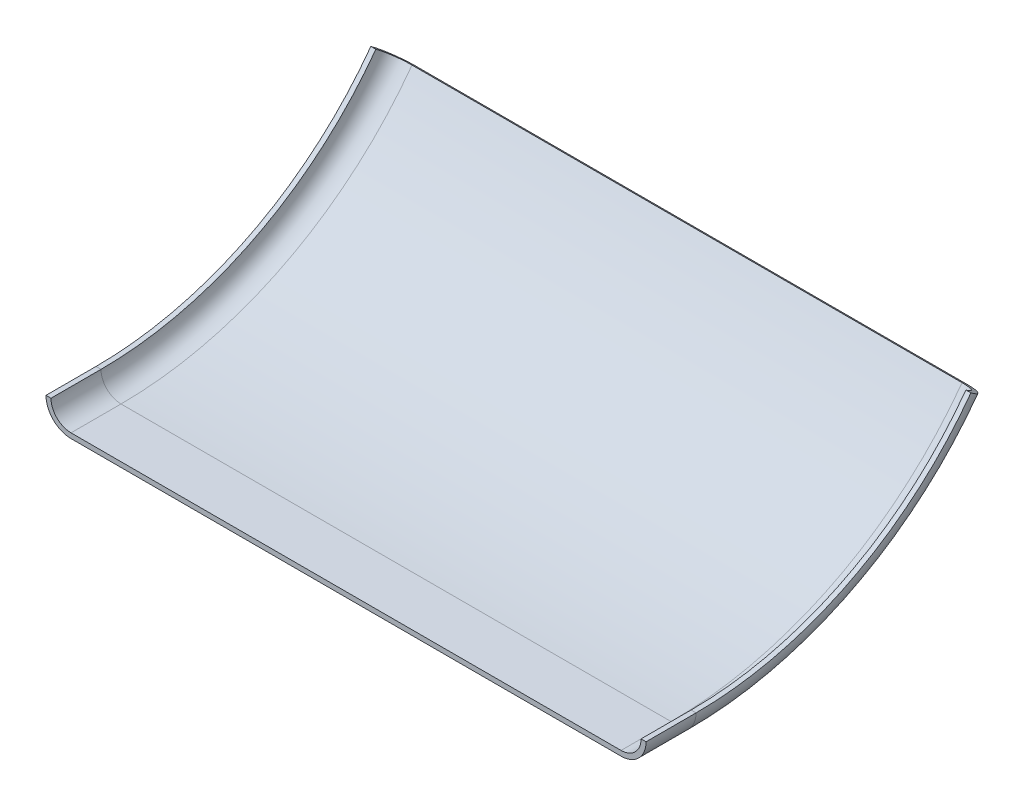
ISO-10303-21;
HEADER;
FILE_DESCRIPTION(('STEP AP214'),'2;1');
FILE_NAME('part.step','',(''),(''),'','','');
FILE_SCHEMA(('AUTOMOTIVE_DESIGN { 1 0 10303 214 1 1 1 1 }'));
ENDSEC;
DATA;
#1=APPLICATION_CONTEXT('core data for automotive mechanical design processes');
#2=APPLICATION_PROTOCOL_DEFINITION('international standard','automotive_design',2000,#1);
#3=PRODUCT_CONTEXT('',#1,'mechanical');
#4=PRODUCT('Part','Part','',(#3));
#5=PRODUCT_RELATED_PRODUCT_CATEGORY('part','',(#4));
#6=PRODUCT_DEFINITION_FORMATION('','',#4);
#7=PRODUCT_DEFINITION_CONTEXT('part definition',#1,'design');
#8=PRODUCT_DEFINITION('design','',#6,#7);
#9=PRODUCT_DEFINITION_SHAPE('','',#8);
#10=(LENGTH_UNIT() NAMED_UNIT(*) SI_UNIT(.MILLI.,.METRE.));
#11=(NAMED_UNIT(*) PLANE_ANGLE_UNIT() SI_UNIT($,.RADIAN.));
#12=(NAMED_UNIT(*) SI_UNIT($,.STERADIAN.) SOLID_ANGLE_UNIT());
#13=UNCERTAINTY_MEASURE_WITH_UNIT(LENGTH_MEASURE(1.E-05),#10,'distance_accuracy_value','');
#14=(GEOMETRIC_REPRESENTATION_CONTEXT(3) GLOBAL_UNCERTAINTY_ASSIGNED_CONTEXT((#13)) GLOBAL_UNIT_ASSIGNED_CONTEXT((#10,
#11,#12)) REPRESENTATION_CONTEXT('',''));
#15=CARTESIAN_POINT('',(0.,0.,0.));
#16=DIRECTION('',(0.,0.,1.));
#17=DIRECTION('',(1.,0.,0.));
#18=AXIS2_PLACEMENT_3D('',#15,#16,#17);
#19=CARTESIAN_POINT('',(-139.7,12.7,0.));
#20=DIRECTION('',(0.,0.,-1.));
#21=DIRECTION('',(-1.,0.,0.));
#22=AXIS2_PLACEMENT_3D('',#19,#20,#21);
#23=PLANE('',#22);
#24=CARTESIAN_POINT('',(-139.7,12.7,0.));
#25=DIRECTION('',(0.,0.,-1.));
#26=DIRECTION('',(-1.,0.,0.));
#27=AXIS2_PLACEMENT_3D('',#24,#25,#26);
#28=CIRCLE('',#27,10.16);
#29=CARTESIAN_POINT('',(-139.7,2.54,0.));
#30=VERTEX_POINT('',#29);
#31=CARTESIAN_POINT('',(-149.86,12.7,0.));
#32=VERTEX_POINT('',#31);
#33=EDGE_CURVE('E186',#30,#32,#28,.T.);
#34=ORIENTED_EDGE('',*,*,#33,.T.);
#35=DIRECTION('',(1.,0.,0.));
#36=VECTOR('',#35,1.);
#37=CARTESIAN_POINT('',(-152.4,12.7,0.));
#38=LINE('',#37,#36);
#39=CARTESIAN_POINT('',(-152.4,12.7,0.));
#40=VERTEX_POINT('',#39);
#41=EDGE_CURVE('E177',#32,#40,#38,.F.);
#42=ORIENTED_EDGE('',*,*,#41,.T.);
#43=CARTESIAN_POINT('',(-139.7,12.7,0.));
#44=DIRECTION('',(0.,0.,-1.));
#45=DIRECTION('',(-1.,0.,0.));
#46=AXIS2_PLACEMENT_3D('',#43,#44,#45);
#47=CIRCLE('',#46,12.7);
#48=CARTESIAN_POINT('',(-139.7,0.,0.));
#49=VERTEX_POINT('',#48);
#50=EDGE_CURVE('E170',#40,#49,#47,.F.);
#51=ORIENTED_EDGE('',*,*,#50,.T.);
#52=DIRECTION('',(1.,0.,0.));
#53=VECTOR('',#52,1.);
#54=CARTESIAN_POINT('',(-139.7,0.,0.));
#55=LINE('',#54,#53);
#56=CARTESIAN_POINT('',(139.7,0.,0.));
#57=VERTEX_POINT('',#56);
#58=EDGE_CURVE('E163',#49,#57,#55,.T.);
#59=ORIENTED_EDGE('',*,*,#58,.T.);
#60=CARTESIAN_POINT('',(139.7,12.7,0.));
#61=DIRECTION('',(0.,0.,1.));
#62=DIRECTION('',(1.,0.,0.));
#63=AXIS2_PLACEMENT_3D('',#60,#61,#62);
#64=CIRCLE('',#63,12.7);
#65=CARTESIAN_POINT('',(152.4,12.7,0.));
#66=VERTEX_POINT('',#65);
#67=EDGE_CURVE('E214',#57,#66,#64,.T.);
#68=ORIENTED_EDGE('',*,*,#67,.T.);
#69=DIRECTION('',(-1.,0.,0.));
#70=VECTOR('',#69,1.);
#71=CARTESIAN_POINT('',(152.4,12.7,0.));
#72=LINE('',#71,#70);
#73=CARTESIAN_POINT('',(149.86,12.7,0.));
#74=VERTEX_POINT('',#73);
#75=EDGE_CURVE('E110',#66,#74,#72,.T.);
#76=ORIENTED_EDGE('',*,*,#75,.T.);
#77=CARTESIAN_POINT('',(139.7,12.7,0.));
#78=DIRECTION('',(0.,0.,1.));
#79=DIRECTION('',(1.,0.,0.));
#80=AXIS2_PLACEMENT_3D('',#77,#78,#79);
#81=CIRCLE('',#80,10.16);
#82=CARTESIAN_POINT('',(139.7,2.54000000000003,0.));
#83=VERTEX_POINT('',#82);
#84=EDGE_CURVE('E102',#74,#83,#81,.F.);
#85=ORIENTED_EDGE('',*,*,#84,.T.);
#86=DIRECTION('',(1.,0.,0.));
#87=VECTOR('',#86,1.);
#88=CARTESIAN_POINT('',(-139.7,2.54,0.));
#89=LINE('',#88,#87);
#90=EDGE_CURVE('E95',#83,#30,#89,.F.);
#91=ORIENTED_EDGE('',*,*,#90,.T.);
#92=EDGE_LOOP('',(#34,#42,#51,#59,#68,#76,#85,#91));
#93=FACE_BOUND('',#92,.T.);
#94=ADVANCED_FACE('F33',(#93),#23,.F.);
#95=CARTESIAN_POINT('',(-139.7,83.6820132389865,-164.997959370007));
#96=DIRECTION('',(0.,0.808034695275051,-0.589134900707601));
#97=DIRECTION('',(-1.,0.,0.));
#98=AXIS2_PLACEMENT_3D('',#95,#96,#97);
#99=PLANE('',#98);
#100=CARTESIAN_POINT('',(-139.7,83.6820132389865,-164.997959370007));
#101=DIRECTION('',(0.,0.808034695275051,-0.589134900707601));
#102=DIRECTION('',(-1.,0.,0.));
#103=AXIS2_PLACEMENT_3D('',#100,#101,#102);
#104=CIRCLE('',#103,10.16);
#105=CARTESIAN_POINT('',(-139.7,77.6964026477973,-173.207591874001));
#106=VERTEX_POINT('',#105);
#107=CARTESIAN_POINT('',(-149.86,83.6820132389865,-164.997959370007));
#108=VERTEX_POINT('',#107);
#109=EDGE_CURVE('E11',#106,#108,#104,.T.);
#110=ORIENTED_EDGE('',*,*,#109,.F.);
#111=DIRECTION('',(1.,0.,0.));
#112=VECTOR('',#111,1.);
#113=CARTESIAN_POINT('',(-139.7,77.6964026477973,-173.207591874001));
#114=LINE('',#113,#112);
#115=CARTESIAN_POINT('',(139.7,77.6964026477973,-173.207591874001));
#116=VERTEX_POINT('',#115);
#117=EDGE_CURVE('E47',#116,#106,#114,.F.);
#118=ORIENTED_EDGE('',*,*,#117,.F.);
#119=CARTESIAN_POINT('',(139.7,83.6820132389865,-164.997959370007));
#120=DIRECTION('',(0.,-0.808034695275051,0.589134900707601));
#121=DIRECTION('',(1.,0.,0.));
#122=AXIS2_PLACEMENT_3D('',#119,#120,#121);
#123=CIRCLE('',#122,10.16);
#124=CARTESIAN_POINT('',(149.86,83.6820132389865,-164.997959370007));
#125=VERTEX_POINT('',#124);
#126=EDGE_CURVE('E56',#125,#116,#123,.F.);
#127=ORIENTED_EDGE('',*,*,#126,.F.);
#128=DIRECTION('',(-1.,0.,0.));
#129=VECTOR('',#128,1.);
#130=CARTESIAN_POINT('',(152.4,83.6820132389865,-164.997959370007));
#131=LINE('',#130,#129);
#132=CARTESIAN_POINT('',(152.4,83.6820132389865,-164.997959370007));
#133=VERTEX_POINT('',#132);
#134=EDGE_CURVE('E233',#133,#125,#131,.T.);
#135=ORIENTED_EDGE('',*,*,#134,.F.);
#136=CARTESIAN_POINT('',(139.7,83.6820132389865,-164.997959370007));
#137=DIRECTION('',(0.,-0.808034695275051,0.589134900707601));
#138=DIRECTION('',(1.,0.,0.));
#139=AXIS2_PLACEMENT_3D('',#136,#137,#138);
#140=CIRCLE('',#139,12.7);
#141=CARTESIAN_POINT('',(139.7,76.2,-175.26));
#142=VERTEX_POINT('',#141);
#143=EDGE_CURVE('E122',#142,#133,#140,.T.);
#144=ORIENTED_EDGE('',*,*,#143,.F.);
#145=DIRECTION('',(1.,0.,0.));
#146=VECTOR('',#145,1.);
#147=CARTESIAN_POINT('',(-139.7,76.2,-175.26));
#148=LINE('',#147,#146);
#149=CARTESIAN_POINT('',(-139.7,76.2,-175.26));
#150=VERTEX_POINT('',#149);
#151=EDGE_CURVE('E130',#150,#142,#148,.T.);
#152=ORIENTED_EDGE('',*,*,#151,.F.);
#153=CARTESIAN_POINT('',(-139.7,83.6820132389865,-164.997959370007));
#154=DIRECTION('',(0.,0.808034695275051,-0.589134900707601));
#155=DIRECTION('',(-1.,0.,0.));
#156=AXIS2_PLACEMENT_3D('',#153,#154,#155);
#157=CIRCLE('',#156,12.7);
#158=CARTESIAN_POINT('',(-152.4,83.6820132389865,-164.997959370007));
#159=VERTEX_POINT('',#158);
#160=EDGE_CURVE('E137',#159,#150,#157,.F.);
#161=ORIENTED_EDGE('',*,*,#160,.F.);
#162=DIRECTION('',(1.,0.,0.));
#163=VECTOR('',#162,1.);
#164=CARTESIAN_POINT('',(-152.4,83.6820132389865,-164.997959370007));
#165=LINE('',#164,#163);
#166=EDGE_CURVE('E198',#108,#159,#165,.F.);
#167=ORIENTED_EDGE('',*,*,#166,.F.);
#168=EDGE_LOOP('',(#110,#118,#127,#135,#144,#152,#161,#167));
#169=FACE_BOUND('',#168,.T.);
#170=ADVANCED_FACE('F275',(#169),#99,.T.);
#171=CARTESIAN_POINT('',(-152.4,12.7,0.));
#172=DIRECTION('',(0.,-1.,0.));
#173=DIRECTION('',(1.,0.,0.));
#174=AXIS2_PLACEMENT_3D('',#171,#172,#173);
#175=PLANE('',#174);
#176=DIRECTION('',(0.,0.,-1.));
#177=VECTOR('',#176,1.);
#178=CARTESIAN_POINT('',(-152.4,12.7,0.));
#179=LINE('',#178,#177);
#180=CARTESIAN_POINT('',(-152.4,12.7,-25.4));
#181=VERTEX_POINT('',#180);
#182=EDGE_CURVE('E183',#40,#181,#179,.T.);
#183=ORIENTED_EDGE('',*,*,#182,.F.);
#184=ORIENTED_EDGE('',*,*,#41,.F.);
#185=DIRECTION('',(0.,0.,-1.));
#186=VECTOR('',#185,1.);
#187=CARTESIAN_POINT('',(-149.86,12.7,0.));
#188=LINE('',#187,#186);
#189=CARTESIAN_POINT('',(-149.86,12.7,-25.4));
#190=VERTEX_POINT('',#189);
#191=EDGE_CURVE('E182',#32,#190,#188,.T.);
#192=ORIENTED_EDGE('',*,*,#191,.T.);
#193=DIRECTION('',(1.,0.,0.));
#194=VECTOR('',#193,1.);
#195=CARTESIAN_POINT('',(-152.4,12.7,-25.4));
#196=LINE('',#195,#194);
#197=EDGE_CURVE('E193',#190,#181,#196,.F.);
#198=ORIENTED_EDGE('',*,*,#197,.T.);
#199=EDGE_LOOP('',(#183,#184,#192,#198));
#200=FACE_BOUND('',#199,.T.);
#201=ADVANCED_FACE('F179',(#200),#175,.F.);
#202=CARTESIAN_POINT('',(-139.7,12.7,0.));
#203=DIRECTION('',(0.,0.,-1.));
#204=DIRECTION('',(-1.,0.,0.));
#205=AXIS2_PLACEMENT_3D('',#202,#203,#204);
#206=CYLINDRICAL_SURFACE('',#205,12.7);
#207=DIRECTION('',(0.,0.,-1.));
#208=VECTOR('',#207,1.);
#209=CARTESIAN_POINT('',(-139.7,0.,0.));
#210=LINE('',#209,#208);
#211=CARTESIAN_POINT('',(-139.7,0.,-25.4));
#212=VERTEX_POINT('',#211);
#213=EDGE_CURVE('E208',#49,#212,#210,.T.);
#214=ORIENTED_EDGE('',*,*,#213,.F.);
#215=ORIENTED_EDGE('',*,*,#50,.F.);
#216=ORIENTED_EDGE('',*,*,#182,.T.);
#217=CARTESIAN_POINT('',(-139.7,12.7,-25.4));
#218=DIRECTION('',(0.,0.,-1.));
#219=DIRECTION('',(-1.,0.,0.));
#220=AXIS2_PLACEMENT_3D('',#217,#218,#219);
#221=CIRCLE('',#220,12.7);
#222=EDGE_CURVE('E205',#181,#212,#221,.F.);
#223=ORIENTED_EDGE('',*,*,#222,.T.);
#224=EDGE_LOOP('',(#214,#215,#216,#223));
#225=FACE_BOUND('',#224,.T.);
#226=ADVANCED_FACE('F282',(#225),#206,.T.);
#227=CARTESIAN_POINT('',(-139.7,0.,0.));
#228=DIRECTION('',(0.,1.,0.));
#229=DIRECTION('',(-1.,0.,0.));
#230=AXIS2_PLACEMENT_3D('',#227,#228,#229);
#231=PLANE('',#230);
#232=DIRECTION('',(0.,0.,-1.));
#233=VECTOR('',#232,1.);
#234=CARTESIAN_POINT('',(139.7,0.,0.));
#235=LINE('',#234,#233);
#236=CARTESIAN_POINT('',(139.7,0.,-25.4));
#237=VERTEX_POINT('',#236);
#238=EDGE_CURVE('E217',#57,#237,#235,.T.);
#239=ORIENTED_EDGE('',*,*,#238,.F.);
#240=ORIENTED_EDGE('',*,*,#58,.F.);
#241=ORIENTED_EDGE('',*,*,#213,.T.);
#242=DIRECTION('',(1.,0.,0.));
#243=VECTOR('',#242,1.);
#244=CARTESIAN_POINT('',(-139.7,0.,-25.4));
#245=LINE('',#244,#243);
#246=EDGE_CURVE('E210',#212,#237,#245,.T.);
#247=ORIENTED_EDGE('',*,*,#246,.T.);
#248=EDGE_LOOP('',(#239,#240,#241,#247));
#249=FACE_BOUND('',#248,.T.);
#250=ADVANCED_FACE('F294',(#249),#231,.F.);
#251=CARTESIAN_POINT('',(139.7,12.7,0.));
#252=DIRECTION('',(0.,0.,-1.));
#253=DIRECTION('',(-1.,0.,0.));
#254=AXIS2_PLACEMENT_3D('',#251,#252,#253);
#255=CYLINDRICAL_SURFACE('',#254,12.7);
#256=DIRECTION('',(0.,0.,-1.));
#257=VECTOR('',#256,1.);
#258=CARTESIAN_POINT('',(152.4,12.7,0.));
#259=LINE('',#258,#257);
#260=CARTESIAN_POINT('',(152.4,12.7,-25.4));
#261=VERTEX_POINT('',#260);
#262=EDGE_CURVE('E226',#66,#261,#259,.T.);
#263=ORIENTED_EDGE('',*,*,#262,.F.);
#264=ORIENTED_EDGE('',*,*,#67,.F.);
#265=ORIENTED_EDGE('',*,*,#238,.T.);
#266=CARTESIAN_POINT('',(139.7,12.7,-25.4));
#267=DIRECTION('',(0.,0.,1.));
#268=DIRECTION('',(1.,0.,0.));
#269=AXIS2_PLACEMENT_3D('',#266,#267,#268);
#270=CIRCLE('',#269,12.7);
#271=EDGE_CURVE('E220',#237,#261,#270,.T.);
#272=ORIENTED_EDGE('',*,*,#271,.T.);
#273=EDGE_LOOP('',(#263,#264,#265,#272));
#274=FACE_BOUND('',#273,.T.);
#275=ADVANCED_FACE('F298',(#274),#255,.T.);
#276=CARTESIAN_POINT('',(152.4,12.7,0.));
#277=DIRECTION('',(0.,-1.,0.));
#278=DIRECTION('',(0.,0.,-1.));
#279=AXIS2_PLACEMENT_3D('',#276,#277,#278);
#280=PLANE('',#279);
#281=DIRECTION('',(0.,0.,-1.));
#282=VECTOR('',#281,1.);
#283=CARTESIAN_POINT('',(149.86,12.7,0.));
#284=LINE('',#283,#282);
#285=CARTESIAN_POINT('',(149.86,12.7,-25.4));
#286=VERTEX_POINT('',#285);
#287=EDGE_CURVE('E237',#74,#286,#284,.T.);
#288=ORIENTED_EDGE('',*,*,#287,.F.);
#289=ORIENTED_EDGE('',*,*,#75,.F.);
#290=ORIENTED_EDGE('',*,*,#262,.T.);
#291=DIRECTION('',(-1.,0.,0.));
#292=VECTOR('',#291,1.);
#293=CARTESIAN_POINT('',(152.4,12.7,-25.4));
#294=LINE('',#293,#292);
#295=EDGE_CURVE('E228',#261,#286,#294,.T.);
#296=ORIENTED_EDGE('',*,*,#295,.T.);
#297=EDGE_LOOP('',(#288,#289,#290,#296));
#298=FACE_BOUND('',#297,.T.);
#299=ADVANCED_FACE('F304',(#298),#280,.F.);
#300=CARTESIAN_POINT('',(139.7,12.7,0.));
#301=DIRECTION('',(0.,0.,-1.));
#302=DIRECTION('',(-1.,0.,0.));
#303=AXIS2_PLACEMENT_3D('',#300,#301,#302);
#304=CYLINDRICAL_SURFACE('',#303,10.16);
#305=DIRECTION('',(0.,0.,-1.));
#306=VECTOR('',#305,1.);
#307=CARTESIAN_POINT('',(139.7,2.54000000000003,0.));
#308=LINE('',#307,#306);
#309=CARTESIAN_POINT('',(139.7,2.54000000000003,-25.4));
#310=VERTEX_POINT('',#309);
#311=EDGE_CURVE('E245',#83,#310,#308,.T.);
#312=ORIENTED_EDGE('',*,*,#311,.F.);
#313=ORIENTED_EDGE('',*,*,#84,.F.);
#314=ORIENTED_EDGE('',*,*,#287,.T.);
#315=CARTESIAN_POINT('',(139.7,12.7,-25.4));
#316=DIRECTION('',(0.,0.,1.));
#317=DIRECTION('',(1.,0.,0.));
#318=AXIS2_PLACEMENT_3D('',#315,#316,#317);
#319=CIRCLE('',#318,10.16);
#320=EDGE_CURVE('E239',#286,#310,#319,.F.);
#321=ORIENTED_EDGE('',*,*,#320,.T.);
#322=EDGE_LOOP('',(#312,#313,#314,#321));
#323=FACE_BOUND('',#322,.T.);
#324=ADVANCED_FACE('F310',(#323),#304,.F.);
#325=CARTESIAN_POINT('',(-139.7,2.54,0.));
#326=DIRECTION('',(0.,-1.,0.));
#327=DIRECTION('',(1.,0.,0.));
#328=AXIS2_PLACEMENT_3D('',#325,#326,#327);
#329=PLANE('',#328);
#330=DIRECTION('',(0.,0.,-1.));
#331=VECTOR('',#330,1.);
#332=CARTESIAN_POINT('',(-139.7,2.54,0.));
#333=LINE('',#332,#331);
#334=CARTESIAN_POINT('',(-139.7,2.54,-25.4));
#335=VERTEX_POINT('',#334);
#336=EDGE_CURVE('E253',#30,#335,#333,.T.);
#337=ORIENTED_EDGE('',*,*,#336,.F.);
#338=ORIENTED_EDGE('',*,*,#90,.F.);
#339=ORIENTED_EDGE('',*,*,#311,.T.);
#340=DIRECTION('',(1.,0.,0.));
#341=VECTOR('',#340,1.);
#342=CARTESIAN_POINT('',(-139.7,2.54,-25.4));
#343=LINE('',#342,#341);
#344=EDGE_CURVE('E247',#310,#335,#343,.F.);
#345=ORIENTED_EDGE('',*,*,#344,.T.);
#346=EDGE_LOOP('',(#337,#338,#339,#345));
#347=FACE_BOUND('',#346,.T.);
#348=ADVANCED_FACE('F259',(#347),#329,.F.);
#349=CARTESIAN_POINT('',(-139.7,12.7,0.));
#350=DIRECTION('',(0.,0.,-1.));
#351=DIRECTION('',(-1.,0.,0.));
#352=AXIS2_PLACEMENT_3D('',#349,#350,#351);
#353=CYLINDRICAL_SURFACE('',#352,10.16);
#354=CARTESIAN_POINT('',(-139.7,12.7,-25.4));
#355=DIRECTION('',(0.,0.,-1.));
#356=DIRECTION('',(-1.,0.,0.));
#357=AXIS2_PLACEMENT_3D('',#354,#355,#356);
#358=CIRCLE('',#357,10.16);
#359=EDGE_CURVE('E192',#335,#190,#358,.T.);
#360=ORIENTED_EDGE('',*,*,#359,.T.);
#361=ORIENTED_EDGE('',*,*,#191,.F.);
#362=ORIENTED_EDGE('',*,*,#33,.F.);
#363=ORIENTED_EDGE('',*,*,#336,.T.);
#364=EDGE_LOOP('',(#360,#361,#362,#363));
#365=FACE_BOUND('',#364,.T.);
#366=ADVANCED_FACE('F191',(#365),#353,.F.);
#367=CARTESIAN_POINT('',(0.,185.462333333333,-25.4));
#368=DIRECTION('',(1.,0.,0.));
#369=DIRECTION('',(0.,0.,-1.));
#370=AXIS2_PLACEMENT_3D('',#367,#368,#369);
#371=CYLINDRICAL_SURFACE('',#370,172.762333333333);
#372=CARTESIAN_POINT('',(-152.4,185.462333333333,-25.4));
#373=DIRECTION('',(1.,0.,0.));
#374=DIRECTION('',(0.,-1.,0.));
#375=AXIS2_PLACEMENT_3D('',#372,#373,#374);
#376=CIRCLE('',#375,172.762333333333);
#377=EDGE_CURVE('E153',#181,#159,#376,.T.);
#378=ORIENTED_EDGE('',*,*,#377,.F.);
#379=ORIENTED_EDGE('',*,*,#197,.F.);
#380=CARTESIAN_POINT('',(-149.86,185.462333333333,-25.4));
#381=DIRECTION('',(1.,0.,0.));
#382=DIRECTION('',(0.,-1.,0.));
#383=AXIS2_PLACEMENT_3D('',#380,#381,#382);
#384=CIRCLE('',#383,172.762333333333);
#385=EDGE_CURVE('E200',#190,#108,#384,.T.);
#386=ORIENTED_EDGE('',*,*,#385,.T.);
#387=ORIENTED_EDGE('',*,*,#166,.T.);
#388=EDGE_LOOP('',(#378,#379,#386,#387));
#389=FACE_BOUND('',#388,.T.);
#390=ADVANCED_FACE('F274',(#389),#371,.F.);
#391=CARTESIAN_POINT('',(-139.7,185.462333333333,-25.4));
#392=DIRECTION('',(1.,0.,0.));
#393=DIRECTION('',(0.,0.,-1.));
#394=AXIS2_PLACEMENT_3D('',#391,#392,#393);
#395=TOROIDAL_SURFACE('',#394,172.762333333333,12.7);
#396=CARTESIAN_POINT('',(-139.7,185.462333333333,-25.4));
#397=DIRECTION('',(1.,0.,0.));
#398=DIRECTION('',(0.,-1.,0.));
#399=AXIS2_PLACEMENT_3D('',#396,#397,#398);
#400=CIRCLE('',#399,185.462333333333);
#401=EDGE_CURVE('E148',#212,#150,#400,.T.);
#402=ORIENTED_EDGE('',*,*,#401,.F.);
#403=ORIENTED_EDGE('',*,*,#222,.F.);
#404=ORIENTED_EDGE('',*,*,#377,.T.);
#405=ORIENTED_EDGE('',*,*,#160,.T.);
#406=EDGE_LOOP('',(#402,#403,#404,#405));
#407=FACE_BOUND('',#406,.T.);
#408=ADVANCED_FACE('F285',(#407),#395,.T.);
#409=CARTESIAN_POINT('',(0.,185.462333333333,-25.4));
#410=DIRECTION('',(1.,0.,0.));
#411=DIRECTION('',(0.,0.,-1.));
#412=AXIS2_PLACEMENT_3D('',#409,#410,#411);
#413=CYLINDRICAL_SURFACE('',#412,185.462333333333);
#414=CARTESIAN_POINT('',(139.7,185.462333333333,-25.4));
#415=DIRECTION('',(1.,0.,0.));
#416=DIRECTION('',(0.,-1.,0.));
#417=AXIS2_PLACEMENT_3D('',#414,#415,#416);
#418=CIRCLE('',#417,185.462333333333);
#419=EDGE_CURVE('E144',#237,#142,#418,.T.);
#420=ORIENTED_EDGE('',*,*,#419,.F.);
#421=ORIENTED_EDGE('',*,*,#246,.F.);
#422=ORIENTED_EDGE('',*,*,#401,.T.);
#423=ORIENTED_EDGE('',*,*,#151,.T.);
#424=EDGE_LOOP('',(#420,#421,#422,#423));
#425=FACE_BOUND('',#424,.T.);
#426=ADVANCED_FACE('F290',(#425),#413,.T.);
#427=CARTESIAN_POINT('',(139.7,185.462333333333,-25.4));
#428=DIRECTION('',(1.,0.,0.));
#429=DIRECTION('',(0.,0.,-1.));
#430=AXIS2_PLACEMENT_3D('',#427,#428,#429);
#431=TOROIDAL_SURFACE('',#430,172.762333333333,12.7);
#432=CARTESIAN_POINT('',(152.4,185.462333333333,-25.4));
#433=DIRECTION('',(1.,0.,0.));
#434=DIRECTION('',(0.,-1.,0.));
#435=AXIS2_PLACEMENT_3D('',#432,#433,#434);
#436=CIRCLE('',#435,172.762333333333);
#437=EDGE_CURVE('E230',#261,#133,#436,.T.);
#438=ORIENTED_EDGE('',*,*,#437,.F.);
#439=ORIENTED_EDGE('',*,*,#271,.F.);
#440=ORIENTED_EDGE('',*,*,#419,.T.);
#441=ORIENTED_EDGE('',*,*,#143,.T.);
#442=EDGE_LOOP('',(#438,#439,#440,#441));
#443=FACE_BOUND('',#442,.T.);
#444=ADVANCED_FACE('F301',(#443),#431,.T.);
#445=CARTESIAN_POINT('',(0.,185.462333333333,-25.4));
#446=DIRECTION('',(1.,0.,0.));
#447=DIRECTION('',(0.,0.,-1.));
#448=AXIS2_PLACEMENT_3D('',#445,#446,#447);
#449=CYLINDRICAL_SURFACE('',#448,172.762333333333);
#450=CARTESIAN_POINT('',(149.86,185.462333333333,-25.4));
#451=DIRECTION('',(1.,0.,0.));
#452=DIRECTION('',(0.,-1.,0.));
#453=AXIS2_PLACEMENT_3D('',#450,#451,#452);
#454=CIRCLE('',#453,172.762333333333);
#455=EDGE_CURVE('E83',#286,#125,#454,.T.);
#456=ORIENTED_EDGE('',*,*,#455,.F.);
#457=ORIENTED_EDGE('',*,*,#295,.F.);
#458=ORIENTED_EDGE('',*,*,#437,.T.);
#459=ORIENTED_EDGE('',*,*,#134,.T.);
#460=EDGE_LOOP('',(#456,#457,#458,#459));
#461=FACE_BOUND('',#460,.T.);
#462=ADVANCED_FACE('F269',(#461),#449,.F.);
#463=CARTESIAN_POINT('',(139.7,185.462333333333,-25.4));
#464=DIRECTION('',(1.,0.,0.));
#465=DIRECTION('',(0.,0.,-1.));
#466=AXIS2_PLACEMENT_3D('',#463,#464,#465);
#467=TOROIDAL_SURFACE('',#466,172.762333333333,10.16);
#468=CARTESIAN_POINT('',(139.7,185.462333333333,-25.4));
#469=DIRECTION('',(1.,0.,0.));
#470=DIRECTION('',(0.,-1.,0.));
#471=AXIS2_PLACEMENT_3D('',#468,#469,#470);
#472=CIRCLE('',#471,182.922333333333);
#473=EDGE_CURVE('E77',#310,#116,#472,.T.);
#474=ORIENTED_EDGE('',*,*,#473,.F.);
#475=ORIENTED_EDGE('',*,*,#320,.F.);
#476=ORIENTED_EDGE('',*,*,#455,.T.);
#477=ORIENTED_EDGE('',*,*,#126,.T.);
#478=EDGE_LOOP('',(#474,#475,#476,#477));
#479=FACE_BOUND('',#478,.T.);
#480=ADVANCED_FACE('F262',(#479),#467,.F.);
#481=CARTESIAN_POINT('',(0.,185.462333333333,-25.4));
#482=DIRECTION('',(1.,0.,0.));
#483=DIRECTION('',(0.,0.,-1.));
#484=AXIS2_PLACEMENT_3D('',#481,#482,#483);
#485=CYLINDRICAL_SURFACE('',#484,182.922333333333);
#486=CARTESIAN_POINT('',(-139.7,185.462333333333,-25.4));
#487=DIRECTION('',(1.,0.,0.));
#488=DIRECTION('',(0.,-1.,0.));
#489=AXIS2_PLACEMENT_3D('',#486,#487,#488);
#490=CIRCLE('',#489,182.922333333333);
#491=EDGE_CURVE('E40',#335,#106,#490,.T.);
#492=ORIENTED_EDGE('',*,*,#491,.F.);
#493=ORIENTED_EDGE('',*,*,#344,.F.);
#494=ORIENTED_EDGE('',*,*,#473,.T.);
#495=ORIENTED_EDGE('',*,*,#117,.T.);
#496=EDGE_LOOP('',(#492,#493,#494,#495));
#497=FACE_BOUND('',#496,.T.);
#498=ADVANCED_FACE('F260',(#497),#485,.F.);
#499=CARTESIAN_POINT('',(-139.7,185.462333333333,-25.4));
#500=DIRECTION('',(1.,0.,0.));
#501=DIRECTION('',(0.,0.,-1.));
#502=AXIS2_PLACEMENT_3D('',#499,#500,#501);
#503=TOROIDAL_SURFACE('',#502,172.762333333333,10.16);
#504=ORIENTED_EDGE('',*,*,#109,.T.);
#505=ORIENTED_EDGE('',*,*,#385,.F.);
#506=ORIENTED_EDGE('',*,*,#359,.F.);
#507=ORIENTED_EDGE('',*,*,#491,.T.);
#508=EDGE_LOOP('',(#504,#505,#506,#507));
#509=FACE_BOUND('',#508,.T.);
#510=ADVANCED_FACE('F257',(#509),#503,.F.);
#511=CLOSED_SHELL('',(#94,#170,#201,#226,#250,#275,#299,#324,#348,#366,#390,#408,#426,#444,#462,
#480,#498,#510));
#512=MANIFOLD_SOLID_BREP('B2',#511);
#513=ADVANCED_BREP_SHAPE_REPRESENTATION('',(#18,#512),#14);
#514=SHAPE_DEFINITION_REPRESENTATION(#9,#513);
ENDSEC;
END-ISO-10303-21;
